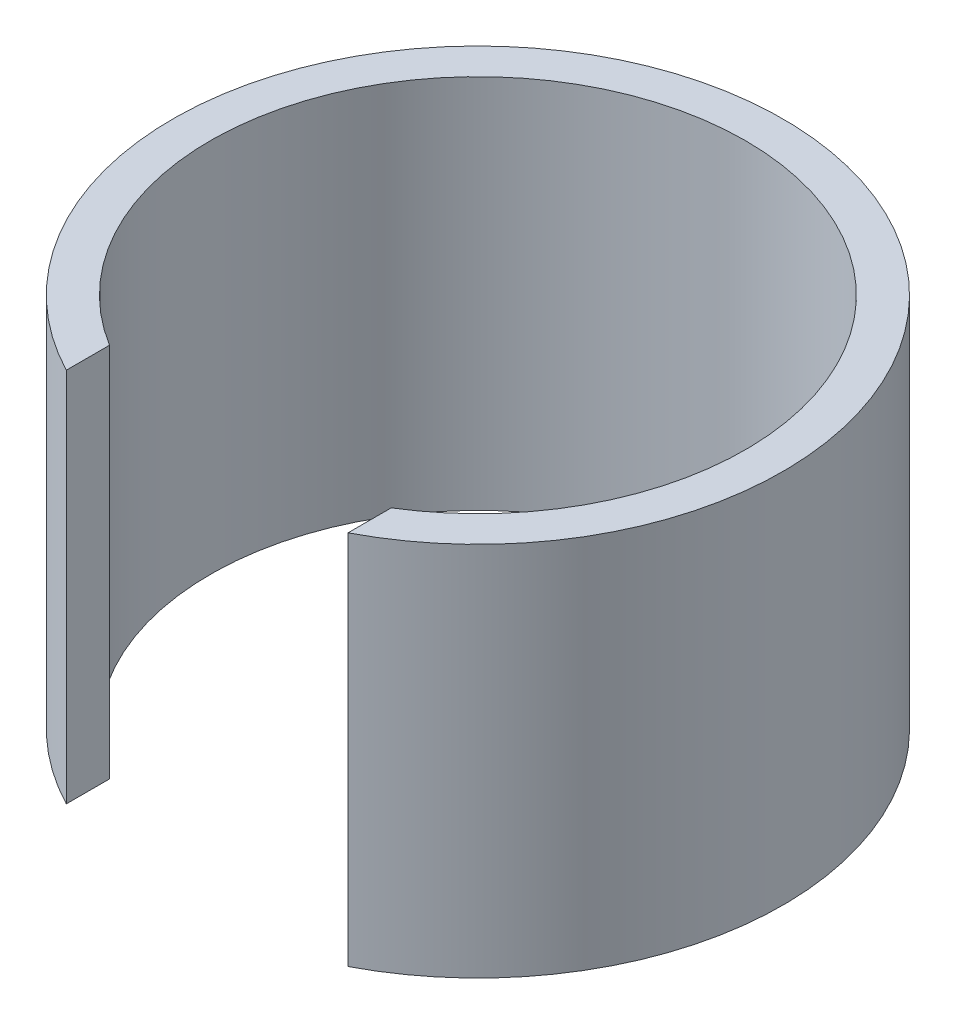
ISO-10303-21;
HEADER;
FILE_DESCRIPTION(('STEP AP214'),'2;1');
FILE_NAME('part.step','',(''),(''),'','','');
FILE_SCHEMA(('AUTOMOTIVE_DESIGN { 1 0 10303 214 1 1 1 1 }'));
ENDSEC;
DATA;
#1=APPLICATION_CONTEXT('core data for automotive mechanical design processes');
#2=APPLICATION_PROTOCOL_DEFINITION('international standard','automotive_design',2000,#1);
#3=PRODUCT_CONTEXT('',#1,'mechanical');
#4=PRODUCT('Part','Part','',(#3));
#5=PRODUCT_RELATED_PRODUCT_CATEGORY('part','',(#4));
#6=PRODUCT_DEFINITION_FORMATION('','',#4);
#7=PRODUCT_DEFINITION_CONTEXT('part definition',#1,'design');
#8=PRODUCT_DEFINITION('design','',#6,#7);
#9=PRODUCT_DEFINITION_SHAPE('','',#8);
#10=(LENGTH_UNIT() NAMED_UNIT(*) SI_UNIT(.MILLI.,.METRE.));
#11=(NAMED_UNIT(*) PLANE_ANGLE_UNIT() SI_UNIT($,.RADIAN.));
#12=(NAMED_UNIT(*) SI_UNIT($,.STERADIAN.) SOLID_ANGLE_UNIT());
#13=UNCERTAINTY_MEASURE_WITH_UNIT(LENGTH_MEASURE(1.E-05),#10,'distance_accuracy_value','');
#14=(GEOMETRIC_REPRESENTATION_CONTEXT(3) GLOBAL_UNCERTAINTY_ASSIGNED_CONTEXT((#13)) GLOBAL_UNIT_ASSIGNED_CONTEXT((#10,
#11,#12)) REPRESENTATION_CONTEXT('',''));
#15=CARTESIAN_POINT('',(0.,0.,0.));
#16=DIRECTION('',(0.,0.,1.));
#17=DIRECTION('',(1.,0.,0.));
#18=AXIS2_PLACEMENT_3D('',#15,#16,#17);
#19=CARTESIAN_POINT('',(0.,40.,0.));
#20=DIRECTION('',(0.,-1.,0.));
#21=DIRECTION('',(0.,0.,-1.));
#22=AXIS2_PLACEMENT_3D('',#19,#20,#21);
#23=CYLINDRICAL_SURFACE('',#22,32.5);
#24=DIRECTION('',(0.,-1.,0.));
#25=VECTOR('',#24,1.);
#26=CARTESIAN_POINT('',(-15.,40.,28.831406486677));
#27=LINE('',#26,#25);
#28=CARTESIAN_POINT('',(-15.,40.,28.831406486677));
#29=VERTEX_POINT('',#28);
#30=CARTESIAN_POINT('',(-15.,0.,28.831406486677));
#31=VERTEX_POINT('',#30);
#32=EDGE_CURVE('E76',#29,#31,#27,.T.);
#33=ORIENTED_EDGE('',*,*,#32,.F.);
#34=CARTESIAN_POINT('',(0.,40.,0.));
#35=DIRECTION('',(0.,1.,0.));
#36=DIRECTION('',(0.,0.,1.));
#37=AXIS2_PLACEMENT_3D('',#34,#35,#36);
#38=CIRCLE('',#37,32.5);
#39=CARTESIAN_POINT('',(15.,40.,28.831406486677));
#40=VERTEX_POINT('',#39);
#41=EDGE_CURVE('E101',#40,#29,#38,.T.);
#42=ORIENTED_EDGE('',*,*,#41,.F.);
#43=DIRECTION('',(0.,-1.,0.));
#44=VECTOR('',#43,1.);
#45=CARTESIAN_POINT('',(15.,40.,28.831406486677));
#46=LINE('',#45,#44);
#47=CARTESIAN_POINT('',(15.,0.,28.831406486677));
#48=VERTEX_POINT('',#47);
#49=EDGE_CURVE('E86',#48,#40,#46,.F.);
#50=ORIENTED_EDGE('',*,*,#49,.F.);
#51=CARTESIAN_POINT('',(0.,0.,0.));
#52=DIRECTION('',(0.,1.,0.));
#53=DIRECTION('',(0.,0.,1.));
#54=AXIS2_PLACEMENT_3D('',#51,#52,#53);
#55=CIRCLE('',#54,32.5);
#56=EDGE_CURVE('E93',#48,#31,#55,.T.);
#57=ORIENTED_EDGE('',*,*,#56,.T.);
#58=EDGE_LOOP('',(#33,#42,#50,#57));
#59=FACE_BOUND('',#58,.T.);
#60=ADVANCED_FACE('F38',(#59),#23,.T.);
#61=CARTESIAN_POINT('',(0.,40.,0.));
#62=DIRECTION('',(0.,1.,0.));
#63=DIRECTION('',(0.,0.,1.));
#64=AXIS2_PLACEMENT_3D('',#61,#62,#63);
#65=PLANE('',#64);
#66=ORIENTED_EDGE('',*,*,#41,.T.);
#67=DIRECTION('',(0.,0.,1.));
#68=VECTOR('',#67,1.);
#69=CARTESIAN_POINT('',(-15.,40.,17.053024247269));
#70=LINE('',#69,#68);
#71=CARTESIAN_POINT('',(-15.,40.,24.2332416321053));
#72=VERTEX_POINT('',#71);
#73=EDGE_CURVE('E79',#72,#29,#70,.T.);
#74=ORIENTED_EDGE('',*,*,#73,.F.);
#75=CARTESIAN_POINT('',(0.,40.,0.));
#76=DIRECTION('',(0.,1.,0.));
#77=DIRECTION('',(0.,0.,1.));
#78=AXIS2_PLACEMENT_3D('',#75,#76,#77);
#79=CIRCLE('',#78,28.5);
#80=CARTESIAN_POINT('',(15.,40.,24.2332416321053));
#81=VERTEX_POINT('',#80);
#82=EDGE_CURVE('E85',#81,#72,#79,.T.);
#83=ORIENTED_EDGE('',*,*,#82,.F.);
#84=DIRECTION('',(0.,0.,-1.));
#85=VECTOR('',#84,1.);
#86=CARTESIAN_POINT('',(15.,40.,17.053024247269));
#87=LINE('',#86,#85);
#88=EDGE_CURVE('E53',#40,#81,#87,.T.);
#89=ORIENTED_EDGE('',*,*,#88,.F.);
#90=EDGE_LOOP('',(#66,#74,#83,#89));
#91=FACE_BOUND('',#90,.T.);
#92=ADVANCED_FACE('F117',(#91),#65,.T.);
#93=CARTESIAN_POINT('',(0.,0.,0.));
#94=DIRECTION('',(0.,1.,0.));
#95=DIRECTION('',(0.,0.,1.));
#96=AXIS2_PLACEMENT_3D('',#93,#94,#95);
#97=PLANE('',#96);
#98=DIRECTION('',(0.,0.,1.));
#99=VECTOR('',#98,1.);
#100=CARTESIAN_POINT('',(-15.,0.,17.053024247269));
#101=LINE('',#100,#99);
#102=CARTESIAN_POINT('',(-15.,0.,24.2332416321053));
#103=VERTEX_POINT('',#102);
#104=EDGE_CURVE('E60',#103,#31,#101,.T.);
#105=ORIENTED_EDGE('',*,*,#104,.T.);
#106=ORIENTED_EDGE('',*,*,#56,.F.);
#107=DIRECTION('',(0.,0.,-1.));
#108=VECTOR('',#107,1.);
#109=CARTESIAN_POINT('',(15.,0.,17.053024247269));
#110=LINE('',#109,#108);
#111=CARTESIAN_POINT('',(15.,0.,24.2332416321053));
#112=VERTEX_POINT('',#111);
#113=EDGE_CURVE('E97',#48,#112,#110,.T.);
#114=ORIENTED_EDGE('',*,*,#113,.T.);
#115=CARTESIAN_POINT('',(0.,0.,0.));
#116=DIRECTION('',(0.,1.,0.));
#117=DIRECTION('',(0.,0.,1.));
#118=AXIS2_PLACEMENT_3D('',#115,#116,#117);
#119=CIRCLE('',#118,28.5);
#120=EDGE_CURVE('E95',#112,#103,#119,.T.);
#121=ORIENTED_EDGE('',*,*,#120,.T.);
#122=EDGE_LOOP('',(#105,#106,#114,#121));
#123=FACE_BOUND('',#122,.T.);
#124=ADVANCED_FACE('F91',(#123),#97,.F.);
#125=CARTESIAN_POINT('',(0.,0.,0.));
#126=DIRECTION('',(0.,1.,0.));
#127=DIRECTION('',(0.,0.,1.));
#128=AXIS2_PLACEMENT_3D('',#125,#126,#127);
#129=CYLINDRICAL_SURFACE('',#128,28.5);
#130=DIRECTION('',(0.,1.,0.));
#131=VECTOR('',#130,1.);
#132=CARTESIAN_POINT('',(-15.,0.,24.2332416321053));
#133=LINE('',#132,#131);
#134=EDGE_CURVE('E11',#103,#72,#133,.T.);
#135=ORIENTED_EDGE('',*,*,#134,.F.);
#136=ORIENTED_EDGE('',*,*,#120,.F.);
#137=DIRECTION('',(0.,1.,0.));
#138=VECTOR('',#137,1.);
#139=CARTESIAN_POINT('',(15.,0.,24.2332416321053));
#140=LINE('',#139,#138);
#141=EDGE_CURVE('E46',#81,#112,#140,.F.);
#142=ORIENTED_EDGE('',*,*,#141,.F.);
#143=ORIENTED_EDGE('',*,*,#82,.T.);
#144=EDGE_LOOP('',(#135,#136,#142,#143));
#145=FACE_BOUND('',#144,.T.);
#146=ADVANCED_FACE('F115',(#145),#129,.F.);
#147=CARTESIAN_POINT('',(15.,40.,17.053024247269));
#148=DIRECTION('',(-1.,0.,0.));
#149=DIRECTION('',(0.,0.,1.));
#150=AXIS2_PLACEMENT_3D('',#147,#148,#149);
#151=PLANE('',#150);
#152=ORIENTED_EDGE('',*,*,#49,.T.);
#153=ORIENTED_EDGE('',*,*,#88,.T.);
#154=ORIENTED_EDGE('',*,*,#141,.T.);
#155=ORIENTED_EDGE('',*,*,#113,.F.);
#156=EDGE_LOOP('',(#152,#153,#154,#155));
#157=FACE_BOUND('',#156,.T.);
#158=ADVANCED_FACE('F109',(#157),#151,.T.);
#159=CARTESIAN_POINT('',(-15.,40.,17.053024247269));
#160=DIRECTION('',(1.,0.,0.));
#161=DIRECTION('',(0.,0.,-1.));
#162=AXIS2_PLACEMENT_3D('',#159,#160,#161);
#163=PLANE('',#162);
#164=ORIENTED_EDGE('',*,*,#32,.T.);
#165=ORIENTED_EDGE('',*,*,#104,.F.);
#166=ORIENTED_EDGE('',*,*,#134,.T.);
#167=ORIENTED_EDGE('',*,*,#73,.T.);
#168=EDGE_LOOP('',(#164,#165,#166,#167));
#169=FACE_BOUND('',#168,.T.);
#170=ADVANCED_FACE('F77',(#169),#163,.T.);
#171=CLOSED_SHELL('',(#60,#92,#124,#146,#158,#170));
#172=MANIFOLD_SOLID_BREP('B2',#171);
#173=ADVANCED_BREP_SHAPE_REPRESENTATION('',(#18,#172),#14);
#174=SHAPE_DEFINITION_REPRESENTATION(#9,#173);
ENDSEC;
END-ISO-10303-21;
